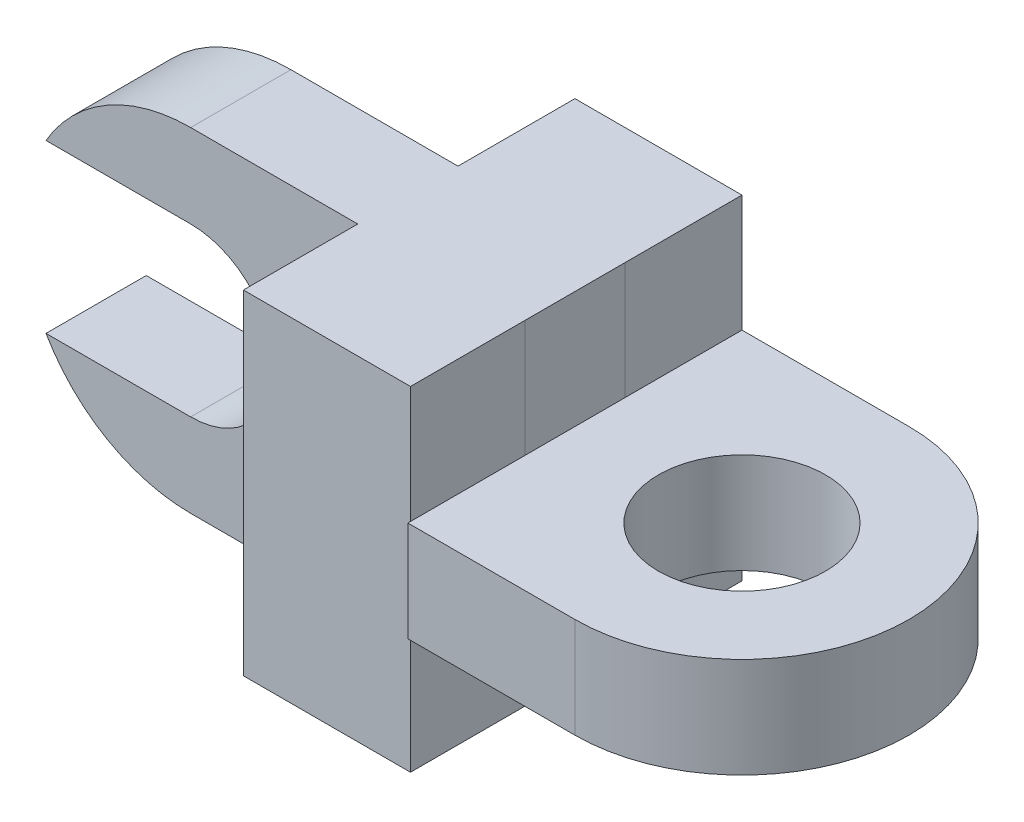
ISO-10303-21;
HEADER;
FILE_DESCRIPTION(('STEP AP214'),'2;1');
FILE_NAME('part.step','',(''),(''),'','','');
FILE_SCHEMA(('AUTOMOTIVE_DESIGN { 1 0 10303 214 1 1 1 1 }'));
ENDSEC;
DATA;
#1=APPLICATION_CONTEXT('core data for automotive mechanical design processes');
#2=APPLICATION_PROTOCOL_DEFINITION('international standard','automotive_design',2000,#1);
#3=PRODUCT_CONTEXT('',#1,'mechanical');
#4=PRODUCT('Part','Part','',(#3));
#5=PRODUCT_RELATED_PRODUCT_CATEGORY('part','',(#4));
#6=PRODUCT_DEFINITION_FORMATION('','',#4);
#7=PRODUCT_DEFINITION_CONTEXT('part definition',#1,'design');
#8=PRODUCT_DEFINITION('design','',#6,#7);
#9=PRODUCT_DEFINITION_SHAPE('','',#8);
#10=(LENGTH_UNIT() NAMED_UNIT(*) SI_UNIT(.MILLI.,.METRE.));
#11=(NAMED_UNIT(*) PLANE_ANGLE_UNIT() SI_UNIT($,.RADIAN.));
#12=(NAMED_UNIT(*) SI_UNIT($,.STERADIAN.) SOLID_ANGLE_UNIT());
#13=UNCERTAINTY_MEASURE_WITH_UNIT(LENGTH_MEASURE(1.E-05),#10,'distance_accuracy_value','');
#14=(GEOMETRIC_REPRESENTATION_CONTEXT(3) GLOBAL_UNCERTAINTY_ASSIGNED_CONTEXT((#13)) GLOBAL_UNIT_ASSIGNED_CONTEXT((#10,
#11,#12)) REPRESENTATION_CONTEXT('',''));
#15=CARTESIAN_POINT('',(0.,0.,0.));
#16=DIRECTION('',(0.,0.,1.));
#17=DIRECTION('',(1.,0.,0.));
#18=AXIS2_PLACEMENT_3D('',#15,#16,#17);
#19=CARTESIAN_POINT('',(-100.,0.,-30.));
#20=DIRECTION('',(0.,0.,1.));
#21=DIRECTION('',(1.,0.,0.));
#22=AXIS2_PLACEMENT_3D('',#19,#20,#21);
#23=PLANE('',#22);
#24=DIRECTION('',(1.,0.,0.));
#25=VECTOR('',#24,1.);
#26=CARTESIAN_POINT('',(-100.,-50.,-30.));
#27=LINE('',#26,#25);
#28=CARTESIAN_POINT('',(-0.00127018922199684,-50.,-30.));
#29=VERTEX_POINT('',#28);
#30=CARTESIAN_POINT('',(0.,-50.,-30.));
#31=VERTEX_POINT('',#30);
#32=EDGE_CURVE('E373',#29,#31,#27,.T.);
#33=ORIENTED_EDGE('',*,*,#32,.F.);
#34=DIRECTION('',(0.,1.,0.));
#35=VECTOR('',#34,1.);
#36=CARTESIAN_POINT('',(-0.00127018922199684,0.,-30.));
#37=LINE('',#36,#35);
#38=CARTESIAN_POINT('',(-0.00127018922199684,-15.,-30.));
#39=VERTEX_POINT('',#38);
#40=EDGE_CURVE('E216',#29,#39,#37,.T.);
#41=ORIENTED_EDGE('',*,*,#40,.T.);
#42=DIRECTION('',(-1.,0.,0.));
#43=VECTOR('',#42,1.);
#44=CARTESIAN_POINT('',(-100.,-15.,-30.));
#45=LINE('',#44,#43);
#46=CARTESIAN_POINT('',(0.,-15.,-30.));
#47=VERTEX_POINT('',#46);
#48=EDGE_CURVE('E348',#47,#39,#45,.T.);
#49=ORIENTED_EDGE('',*,*,#48,.F.);
#50=DIRECTION('',(0.,1.,0.));
#51=VECTOR('',#50,1.);
#52=CARTESIAN_POINT('',(0.,-15.,-30.));
#53=LINE('',#52,#51);
#54=EDGE_CURVE('E377',#31,#47,#53,.T.);
#55=ORIENTED_EDGE('',*,*,#54,.F.);
#56=EDGE_LOOP('',(#33,#41,#49,#55));
#57=FACE_BOUND('',#56,.T.);
#58=ADVANCED_FACE('F42',(#57),#23,.F.);
#59=DIRECTION('',(-1.,0.,0.));
#60=VECTOR('',#59,1.);
#61=CARTESIAN_POINT('',(-100.,15.,-30.));
#62=LINE('',#61,#60);
#63=CARTESIAN_POINT('',(0.,15.,-30.));
#64=VERTEX_POINT('',#63);
#65=CARTESIAN_POINT('',(-0.00127018922199684,15.,-30.));
#66=VERTEX_POINT('',#65);
#67=EDGE_CURVE('E337',#64,#66,#62,.T.);
#68=ORIENTED_EDGE('',*,*,#67,.T.);
#69=CARTESIAN_POINT('',(-0.00127018922199684,50.,-30.));
#70=VERTEX_POINT('',#69);
#71=EDGE_CURVE('E288',#66,#70,#37,.T.);
#72=ORIENTED_EDGE('',*,*,#71,.T.);
#73=DIRECTION('',(-1.,0.,0.));
#74=VECTOR('',#73,1.);
#75=CARTESIAN_POINT('',(-100.,50.,-30.));
#76=LINE('',#75,#74);
#77=CARTESIAN_POINT('',(0.,50.,-30.));
#78=VERTEX_POINT('',#77);
#79=EDGE_CURVE('E386',#78,#70,#76,.T.);
#80=ORIENTED_EDGE('',*,*,#79,.F.);
#81=DIRECTION('',(0.,1.,0.));
#82=VECTOR('',#81,1.);
#83=CARTESIAN_POINT('',(0.,50.,-30.));
#84=LINE('',#83,#82);
#85=EDGE_CURVE('E381',#64,#78,#84,.T.);
#86=ORIENTED_EDGE('',*,*,#85,.F.);
#87=EDGE_LOOP('',(#68,#72,#80,#86));
#88=FACE_BOUND('',#87,.T.);
#89=ADVANCED_FACE('F547',(#88),#23,.F.);
#90=CARTESIAN_POINT('',(-100.,0.,0.));
#91=DIRECTION('',(0.,0.,1.));
#92=DIRECTION('',(1.,0.,0.));
#93=AXIS2_PLACEMENT_3D('',#90,#91,#92);
#94=PLANE('',#93);
#95=DIRECTION('',(0.,1.,0.));
#96=VECTOR('',#95,1.);
#97=CARTESIAN_POINT('',(-0.00127018922199684,0.,0.));
#98=LINE('',#97,#96);
#99=CARTESIAN_POINT('',(-0.0012701892220246,-50.,0.));
#100=VERTEX_POINT('',#99);
#101=CARTESIAN_POINT('',(-0.00127018922199684,-15.,0.));
#102=VERTEX_POINT('',#101);
#103=EDGE_CURVE('E284',#100,#102,#98,.T.);
#104=ORIENTED_EDGE('',*,*,#103,.F.);
#105=DIRECTION('',(1.,0.,0.));
#106=VECTOR('',#105,1.);
#107=CARTESIAN_POINT('',(-100.,-50.,0.));
#108=LINE('',#107,#106);
#109=CARTESIAN_POINT('',(0.,-50.,0.));
#110=VERTEX_POINT('',#109);
#111=EDGE_CURVE('E410',#100,#110,#108,.T.);
#112=ORIENTED_EDGE('',*,*,#111,.T.);
#113=DIRECTION('',(0.,1.,0.));
#114=VECTOR('',#113,1.);
#115=CARTESIAN_POINT('',(0.,-15.,0.));
#116=LINE('',#115,#114);
#117=CARTESIAN_POINT('',(0.,-15.,0.));
#118=VERTEX_POINT('',#117);
#119=EDGE_CURVE('E414',#110,#118,#116,.T.);
#120=ORIENTED_EDGE('',*,*,#119,.T.);
#121=DIRECTION('',(-1.,0.,0.));
#122=VECTOR('',#121,1.);
#123=CARTESIAN_POINT('',(-100.,-15.,0.));
#124=LINE('',#123,#122);
#125=EDGE_CURVE('E11',#118,#102,#124,.T.);
#126=ORIENTED_EDGE('',*,*,#125,.T.);
#127=EDGE_LOOP('',(#104,#112,#120,#126));
#128=FACE_BOUND('',#127,.T.);
#129=ADVANCED_FACE('F540',(#128),#94,.T.);
#130=CARTESIAN_POINT('',(-0.00127018922199684,15.,0.));
#131=VERTEX_POINT('',#130);
#132=CARTESIAN_POINT('',(-0.00127018922199684,50.,0.));
#133=VERTEX_POINT('',#132);
#134=EDGE_CURVE('E275',#131,#133,#98,.T.);
#135=ORIENTED_EDGE('',*,*,#134,.F.);
#136=DIRECTION('',(-1.,0.,0.));
#137=VECTOR('',#136,1.);
#138=CARTESIAN_POINT('',(-100.,15.,0.));
#139=LINE('',#138,#137);
#140=CARTESIAN_POINT('',(0.,15.,0.));
#141=VERTEX_POINT('',#140);
#142=EDGE_CURVE('E52',#141,#131,#139,.T.);
#143=ORIENTED_EDGE('',*,*,#142,.F.);
#144=DIRECTION('',(0.,1.,0.));
#145=VECTOR('',#144,1.);
#146=CARTESIAN_POINT('',(0.,50.,0.));
#147=LINE('',#146,#145);
#148=CARTESIAN_POINT('',(0.,50.,0.));
#149=VERTEX_POINT('',#148);
#150=EDGE_CURVE('E418',#141,#149,#147,.T.);
#151=ORIENTED_EDGE('',*,*,#150,.T.);
#152=DIRECTION('',(-1.,0.,0.));
#153=VECTOR('',#152,1.);
#154=CARTESIAN_POINT('',(-100.,50.,0.));
#155=LINE('',#154,#153);
#156=EDGE_CURVE('E67',#149,#133,#155,.T.);
#157=ORIENTED_EDGE('',*,*,#156,.T.);
#158=EDGE_LOOP('',(#135,#143,#151,#157));
#159=FACE_BOUND('',#158,.T.);
#160=ADVANCED_FACE('F541',(#159),#94,.T.);
#161=CARTESIAN_POINT('',(-50.001270189222,50.,-30.));
#162=VERTEX_POINT('',#161);
#163=CARTESIAN_POINT('',(-100.,50.,-30.));
#164=VERTEX_POINT('',#163);
#165=EDGE_CURVE('E385',#162,#164,#76,.T.);
#166=ORIENTED_EDGE('',*,*,#165,.F.);
#167=DIRECTION('',(0.,-1.,0.));
#168=VECTOR('',#167,1.);
#169=CARTESIAN_POINT('',(-50.001270189222,0.,-30.));
#170=LINE('',#169,#168);
#171=CARTESIAN_POINT('',(-50.001270189222,-50.,-30.));
#172=VERTEX_POINT('',#171);
#173=EDGE_CURVE('E293',#162,#172,#170,.T.);
#174=ORIENTED_EDGE('',*,*,#173,.T.);
#175=CARTESIAN_POINT('',(-100.,-50.,-30.));
#176=VERTEX_POINT('',#175);
#177=EDGE_CURVE('E374',#176,#172,#27,.T.);
#178=ORIENTED_EDGE('',*,*,#177,.F.);
#179=CARTESIAN_POINT('',(-100.,0.,-30.));
#180=DIRECTION('',(0.,0.,1.));
#181=DIRECTION('',(1.,0.,0.));
#182=AXIS2_PLACEMENT_3D('',#179,#180,#181);
#183=CIRCLE('',#182,50.);
#184=CARTESIAN_POINT('',(-143.301270189222,-25.,-30.));
#185=VERTEX_POINT('',#184);
#186=EDGE_CURVE('E369',#185,#176,#183,.T.);
#187=ORIENTED_EDGE('',*,*,#186,.F.);
#188=DIRECTION('',(-1.,0.,0.));
#189=VECTOR('',#188,1.);
#190=CARTESIAN_POINT('',(-100.,-25.,-30.));
#191=LINE('',#190,#189);
#192=CARTESIAN_POINT('',(-100.,-25.,-30.));
#193=VERTEX_POINT('',#192);
#194=EDGE_CURVE('E365',#193,#185,#191,.T.);
#195=ORIENTED_EDGE('',*,*,#194,.F.);
#196=CARTESIAN_POINT('',(-100.,0.,-30.));
#197=DIRECTION('',(0.,0.,-1.));
#198=DIRECTION('',(1.,0.,0.));
#199=AXIS2_PLACEMENT_3D('',#196,#197,#198);
#200=CIRCLE('',#199,25.);
#201=CARTESIAN_POINT('',(-100.,25.,-30.));
#202=VERTEX_POINT('',#201);
#203=EDGE_CURVE('E361',#202,#193,#200,.T.);
#204=ORIENTED_EDGE('',*,*,#203,.F.);
#205=DIRECTION('',(1.,0.,0.));
#206=VECTOR('',#205,1.);
#207=CARTESIAN_POINT('',(-100.,25.,-30.));
#208=LINE('',#207,#206);
#209=CARTESIAN_POINT('',(-143.301270189222,25.,-30.));
#210=VERTEX_POINT('',#209);
#211=EDGE_CURVE('E357',#210,#202,#208,.T.);
#212=ORIENTED_EDGE('',*,*,#211,.F.);
#213=CARTESIAN_POINT('',(-100.,0.,-30.));
#214=DIRECTION('',(0.,0.,1.));
#215=DIRECTION('',(1.,0.,0.));
#216=AXIS2_PLACEMENT_3D('',#213,#214,#215);
#217=CIRCLE('',#216,50.);
#218=EDGE_CURVE('E353',#164,#210,#217,.T.);
#219=ORIENTED_EDGE('',*,*,#218,.F.);
#220=EDGE_LOOP('',(#166,#174,#178,#187,#195,#204,#212,#219));
#221=FACE_BOUND('',#220,.T.);
#222=ADVANCED_FACE('F530',(#221),#23,.F.);
#223=DIRECTION('',(0.,-1.,0.));
#224=VECTOR('',#223,1.);
#225=CARTESIAN_POINT('',(-50.001270189222,0.,0.));
#226=LINE('',#225,#224);
#227=CARTESIAN_POINT('',(-50.001270189222,50.,0.));
#228=VERTEX_POINT('',#227);
#229=CARTESIAN_POINT('',(-50.001270189222,-50.,0.));
#230=VERTEX_POINT('',#229);
#231=EDGE_CURVE('E59',#228,#230,#226,.T.);
#232=ORIENTED_EDGE('',*,*,#231,.F.);
#233=CARTESIAN_POINT('',(-100.,50.,0.));
#234=VERTEX_POINT('',#233);
#235=EDGE_CURVE('E421',#228,#234,#155,.T.);
#236=ORIENTED_EDGE('',*,*,#235,.T.);
#237=CARTESIAN_POINT('',(-100.,0.,0.));
#238=DIRECTION('',(0.,0.,1.));
#239=DIRECTION('',(1.,0.,0.));
#240=AXIS2_PLACEMENT_3D('',#237,#238,#239);
#241=CIRCLE('',#240,50.);
#242=CARTESIAN_POINT('',(-143.301270189222,25.,0.));
#243=VERTEX_POINT('',#242);
#244=EDGE_CURVE('E352',#234,#243,#241,.T.);
#245=ORIENTED_EDGE('',*,*,#244,.T.);
#246=DIRECTION('',(1.,0.,0.));
#247=VECTOR('',#246,1.);
#248=CARTESIAN_POINT('',(-100.,25.,0.));
#249=LINE('',#248,#247);
#250=CARTESIAN_POINT('',(-100.,25.,0.));
#251=VERTEX_POINT('',#250);
#252=EDGE_CURVE('E394',#243,#251,#249,.T.);
#253=ORIENTED_EDGE('',*,*,#252,.T.);
#254=CARTESIAN_POINT('',(-100.,0.,0.));
#255=DIRECTION('',(0.,0.,-1.));
#256=DIRECTION('',(1.,0.,0.));
#257=AXIS2_PLACEMENT_3D('',#254,#255,#256);
#258=CIRCLE('',#257,25.);
#259=CARTESIAN_POINT('',(-100.,-25.,0.));
#260=VERTEX_POINT('',#259);
#261=EDGE_CURVE('E398',#251,#260,#258,.T.);
#262=ORIENTED_EDGE('',*,*,#261,.T.);
#263=DIRECTION('',(-1.,0.,0.));
#264=VECTOR('',#263,1.);
#265=CARTESIAN_POINT('',(-100.,-25.,0.));
#266=LINE('',#265,#264);
#267=CARTESIAN_POINT('',(-143.301270189222,-25.,0.));
#268=VERTEX_POINT('',#267);
#269=EDGE_CURVE('E402',#260,#268,#266,.T.);
#270=ORIENTED_EDGE('',*,*,#269,.T.);
#271=CARTESIAN_POINT('',(-100.,0.,0.));
#272=DIRECTION('',(0.,0.,1.));
#273=DIRECTION('',(1.,0.,0.));
#274=AXIS2_PLACEMENT_3D('',#271,#272,#273);
#275=CIRCLE('',#274,50.);
#276=CARTESIAN_POINT('',(-100.,-50.,0.));
#277=VERTEX_POINT('',#276);
#278=EDGE_CURVE('E406',#268,#277,#275,.T.);
#279=ORIENTED_EDGE('',*,*,#278,.T.);
#280=EDGE_CURVE('E411',#277,#230,#108,.T.);
#281=ORIENTED_EDGE('',*,*,#280,.T.);
#282=EDGE_LOOP('',(#232,#236,#245,#253,#262,#270,#279,#281));
#283=FACE_BOUND('',#282,.T.);
#284=ADVANCED_FACE('F537',(#283),#94,.T.);
#285=CARTESIAN_POINT('',(-100.,0.,-30.));
#286=DIRECTION('',(0.,0.,1.));
#287=DIRECTION('',(1.,0.,0.));
#288=AXIS2_PLACEMENT_3D('',#285,#286,#287);
#289=CYLINDRICAL_SURFACE('',#288,50.);
#290=ORIENTED_EDGE('',*,*,#244,.F.);
#291=DIRECTION('',(0.,0.,1.));
#292=VECTOR('',#291,1.);
#293=CARTESIAN_POINT('',(-100.,50.,-30.));
#294=LINE('',#293,#292);
#295=EDGE_CURVE('E424',#164,#234,#294,.T.);
#296=ORIENTED_EDGE('',*,*,#295,.F.);
#297=ORIENTED_EDGE('',*,*,#218,.T.);
#298=DIRECTION('',(0.,0.,1.));
#299=VECTOR('',#298,1.);
#300=CARTESIAN_POINT('',(-143.301270189222,25.,-30.));
#301=LINE('',#300,#299);
#302=EDGE_CURVE('E390',#210,#243,#301,.T.);
#303=ORIENTED_EDGE('',*,*,#302,.T.);
#304=EDGE_LOOP('',(#290,#296,#297,#303));
#305=FACE_BOUND('',#304,.T.);
#306=ADVANCED_FACE('F44',(#305),#289,.T.);
#307=CARTESIAN_POINT('',(-100.,50.,-30.));
#308=DIRECTION('',(0.,1.,0.));
#309=DIRECTION('',(0.,0.,1.));
#310=AXIS2_PLACEMENT_3D('',#307,#308,#309);
#311=PLANE('',#310);
#312=ORIENTED_EDGE('',*,*,#235,.F.);
#313=DIRECTION('',(0.,0.,1.));
#314=VECTOR('',#313,1.);
#315=CARTESIAN_POINT('',(-50.001270189222,50.,34.2134446650193));
#316=LINE('',#315,#314);
#317=CARTESIAN_POINT('',(-50.001270189222,50.,34.2134446650193));
#318=VERTEX_POINT('',#317);
#319=EDGE_CURVE('E263',#228,#318,#316,.T.);
#320=ORIENTED_EDGE('',*,*,#319,.T.);
#321=DIRECTION('',(1.,0.,0.));
#322=VECTOR('',#321,1.);
#323=CARTESIAN_POINT('',(-50.001270189222,50.,34.2134446650193));
#324=LINE('',#323,#322);
#325=CARTESIAN_POINT('',(-0.00127018922199684,50.,34.2134446650193));
#326=VERTEX_POINT('',#325);
#327=EDGE_CURVE('E222',#318,#326,#324,.T.);
#328=ORIENTED_EDGE('',*,*,#327,.T.);
#329=DIRECTION('',(0.,0.,-1.));
#330=VECTOR('',#329,1.);
#331=CARTESIAN_POINT('',(-0.00127018922199684,50.,34.2134446650193));
#332=LINE('',#331,#330);
#333=EDGE_CURVE('E254',#326,#133,#332,.T.);
#334=ORIENTED_EDGE('',*,*,#333,.T.);
#335=ORIENTED_EDGE('',*,*,#156,.F.);
#336=DIRECTION('',(0.,0.,1.));
#337=VECTOR('',#336,1.);
#338=CARTESIAN_POINT('',(0.,50.,-30.));
#339=LINE('',#338,#337);
#340=EDGE_CURVE('E428',#78,#149,#339,.T.);
#341=ORIENTED_EDGE('',*,*,#340,.F.);
#342=ORIENTED_EDGE('',*,*,#79,.T.);
#343=CARTESIAN_POINT('',(-0.00127018922199684,50.,-65.));
#344=VERTEX_POINT('',#343);
#345=EDGE_CURVE('E259',#70,#344,#332,.T.);
#346=ORIENTED_EDGE('',*,*,#345,.T.);
#347=DIRECTION('',(-1.,0.,0.));
#348=VECTOR('',#347,1.);
#349=CARTESIAN_POINT('',(-50.001270189222,50.,-65.));
#350=LINE('',#349,#348);
#351=CARTESIAN_POINT('',(-50.001270189222,50.,-65.));
#352=VERTEX_POINT('',#351);
#353=EDGE_CURVE('E258',#344,#352,#350,.T.);
#354=ORIENTED_EDGE('',*,*,#353,.T.);
#355=EDGE_CURVE('E264',#352,#162,#316,.T.);
#356=ORIENTED_EDGE('',*,*,#355,.T.);
#357=ORIENTED_EDGE('',*,*,#165,.T.);
#358=ORIENTED_EDGE('',*,*,#295,.T.);
#359=EDGE_LOOP('',(#312,#320,#328,#334,#335,#341,#342,#346,#354,#356,#357,#358));
#360=FACE_BOUND('',#359,.T.);
#361=ADVANCED_FACE('F500',(#360),#311,.T.);
#362=CARTESIAN_POINT('',(0.,50.,-30.));
#363=DIRECTION('',(1.,0.,0.));
#364=DIRECTION('',(0.,1.,0.));
#365=AXIS2_PLACEMENT_3D('',#362,#363,#364);
#366=PLANE('',#365);
#367=ORIENTED_EDGE('',*,*,#150,.F.);
#368=DIRECTION('',(0.,0.,1.));
#369=VECTOR('',#368,1.);
#370=CARTESIAN_POINT('',(0.,15.,-30.));
#371=LINE('',#370,#369);
#372=EDGE_CURVE('E431',#64,#141,#371,.T.);
#373=ORIENTED_EDGE('',*,*,#372,.F.);
#374=ORIENTED_EDGE('',*,*,#85,.T.);
#375=ORIENTED_EDGE('',*,*,#340,.T.);
#376=EDGE_LOOP('',(#367,#373,#374,#375));
#377=FACE_BOUND('',#376,.T.);
#378=ADVANCED_FACE('F669',(#377),#366,.T.);
#379=CARTESIAN_POINT('',(0.,15.,-30.));
#380=DIRECTION('',(0.,1.,0.));
#381=DIRECTION('',(0.,0.,1.));
#382=AXIS2_PLACEMENT_3D('',#379,#380,#381);
#383=PLANE('',#382);
#384=CARTESIAN_POINT('',(49.998729810778,15.,-15.));
#385=DIRECTION('',(0.,1.,0.));
#386=DIRECTION('',(0.,0.,1.));
#387=AXIS2_PLACEMENT_3D('',#384,#385,#386);
#388=CIRCLE('',#387,25.);
#389=CARTESIAN_POINT('',(49.998729810778,15.,9.99999999999999));
#390=VERTEX_POINT('',#389);
#391=EDGE_CURVE('E297',#390,#390,#388,.T.);
#392=ORIENTED_EDGE('',*,*,#391,.F.);
#393=EDGE_LOOP('',(#392));
#394=FACE_BOUND('',#393,.T.);
#395=DIRECTION('',(1.,0.,0.));
#396=VECTOR('',#395,1.);
#397=CARTESIAN_POINT('',(-0.00127018922199684,15.,35.));
#398=LINE('',#397,#396);
#399=CARTESIAN_POINT('',(-0.00127018922199684,15.,35.));
#400=VERTEX_POINT('',#399);
#401=CARTESIAN_POINT('',(49.998729810778,15.,35.));
#402=VERTEX_POINT('',#401);
#403=EDGE_CURVE('E317',#400,#402,#398,.T.);
#404=ORIENTED_EDGE('',*,*,#403,.T.);
#405=CARTESIAN_POINT('',(49.998729810778,15.,-15.));
#406=DIRECTION('',(0.,1.,0.));
#407=DIRECTION('',(0.,0.,1.));
#408=AXIS2_PLACEMENT_3D('',#405,#406,#407);
#409=CIRCLE('',#408,50.);
#410=CARTESIAN_POINT('',(49.998729810778,15.,-65.));
#411=VERTEX_POINT('',#410);
#412=EDGE_CURVE('E321',#402,#411,#409,.T.);
#413=ORIENTED_EDGE('',*,*,#412,.T.);
#414=DIRECTION('',(-1.,0.,0.));
#415=VECTOR('',#414,1.);
#416=CARTESIAN_POINT('',(49.998729810778,15.,-65.));
#417=LINE('',#416,#415);
#418=CARTESIAN_POINT('',(-0.00127018922199684,15.,-65.));
#419=VERTEX_POINT('',#418);
#420=EDGE_CURVE('E324',#411,#419,#417,.T.);
#421=ORIENTED_EDGE('',*,*,#420,.T.);
#422=DIRECTION('',(0.,0.,1.));
#423=VECTOR('',#422,1.);
#424=CARTESIAN_POINT('',(-0.00127018922199684,15.,-65.));
#425=LINE('',#424,#423);
#426=EDGE_CURVE('E306',#419,#66,#425,.T.);
#427=ORIENTED_EDGE('',*,*,#426,.T.);
#428=ORIENTED_EDGE('',*,*,#67,.F.);
#429=ORIENTED_EDGE('',*,*,#372,.T.);
#430=ORIENTED_EDGE('',*,*,#142,.T.);
#431=CARTESIAN_POINT('',(-0.00127018922199684,15.,34.2134446650193));
#432=VERTEX_POINT('',#431);
#433=EDGE_CURVE('E332',#131,#432,#425,.T.);
#434=ORIENTED_EDGE('',*,*,#433,.T.);
#435=EDGE_CURVE('E328',#432,#400,#425,.T.);
#436=ORIENTED_EDGE('',*,*,#435,.T.);
#437=EDGE_LOOP('',(#404,#413,#421,#427,#428,#429,#430,#434,#436));
#438=FACE_BOUND('',#437,.T.);
#439=ADVANCED_FACE('F460',(#394,#438),#383,.T.);
#440=CARTESIAN_POINT('',(0.,-15.,-30.));
#441=DIRECTION('',(0.,-1.,0.));
#442=DIRECTION('',(0.,0.,-1.));
#443=AXIS2_PLACEMENT_3D('',#440,#441,#442);
#444=PLANE('',#443);
#445=CARTESIAN_POINT('',(49.998729810778,-15.,-15.));
#446=DIRECTION('',(0.,-1.,0.));
#447=DIRECTION('',(0.,0.,-1.));
#448=AXIS2_PLACEMENT_3D('',#445,#446,#447);
#449=CIRCLE('',#448,25.);
#450=CARTESIAN_POINT('',(49.998729810778,-15.,9.99999999999999));
#451=VERTEX_POINT('',#450);
#452=EDGE_CURVE('E46',#451,#451,#449,.T.);
#453=ORIENTED_EDGE('',*,*,#452,.F.);
#454=EDGE_LOOP('',(#453));
#455=FACE_BOUND('',#454,.T.);
#456=CARTESIAN_POINT('',(49.998729810778,-15.,-15.));
#457=DIRECTION('',(0.,1.,0.));
#458=DIRECTION('',(0.,0.,1.));
#459=AXIS2_PLACEMENT_3D('',#456,#457,#458);
#460=CIRCLE('',#459,50.);
#461=CARTESIAN_POINT('',(49.998729810778,-15.,35.));
#462=VERTEX_POINT('',#461);
#463=CARTESIAN_POINT('',(49.998729810778,-15.,-65.));
#464=VERTEX_POINT('',#463);
#465=EDGE_CURVE('E305',#462,#464,#460,.T.);
#466=ORIENTED_EDGE('',*,*,#465,.F.);
#467=DIRECTION('',(1.,0.,0.));
#468=VECTOR('',#467,1.);
#469=CARTESIAN_POINT('',(-0.00127018922199684,-15.,35.));
#470=LINE('',#469,#468);
#471=CARTESIAN_POINT('',(-0.00127018922199684,-15.,35.));
#472=VERTEX_POINT('',#471);
#473=EDGE_CURVE('E301',#472,#462,#470,.T.);
#474=ORIENTED_EDGE('',*,*,#473,.F.);
#475=DIRECTION('',(0.,0.,1.));
#476=VECTOR('',#475,1.);
#477=CARTESIAN_POINT('',(-0.00127018922199684,-15.,-65.));
#478=LINE('',#477,#476);
#479=CARTESIAN_POINT('',(-0.00127018922199684,-15.,34.2134446650193));
#480=VERTEX_POINT('',#479);
#481=EDGE_CURVE('E311',#480,#472,#478,.T.);
#482=ORIENTED_EDGE('',*,*,#481,.F.);
#483=EDGE_CURVE('E316',#102,#480,#478,.T.);
#484=ORIENTED_EDGE('',*,*,#483,.F.);
#485=ORIENTED_EDGE('',*,*,#125,.F.);
#486=DIRECTION('',(0.,0.,1.));
#487=VECTOR('',#486,1.);
#488=CARTESIAN_POINT('',(0.,-15.,-30.));
#489=LINE('',#488,#487);
#490=EDGE_CURVE('E435',#47,#118,#489,.T.);
#491=ORIENTED_EDGE('',*,*,#490,.F.);
#492=ORIENTED_EDGE('',*,*,#48,.T.);
#493=CARTESIAN_POINT('',(-0.00127018922199684,-15.,-65.));
#494=VERTEX_POINT('',#493);
#495=EDGE_CURVE('E312',#494,#39,#478,.T.);
#496=ORIENTED_EDGE('',*,*,#495,.F.);
#497=DIRECTION('',(-1.,0.,0.));
#498=VECTOR('',#497,1.);
#499=CARTESIAN_POINT('',(49.998729810778,-15.,-65.));
#500=LINE('',#499,#498);
#501=EDGE_CURVE('E231',#464,#494,#500,.T.);
#502=ORIENTED_EDGE('',*,*,#501,.F.);
#503=EDGE_LOOP('',(#466,#474,#482,#484,#485,#491,#492,#496,#502));
#504=FACE_BOUND('',#503,.T.);
#505=ADVANCED_FACE('F730',(#455,#504),#444,.T.);
#506=CARTESIAN_POINT('',(0.,-15.,-30.));
#507=DIRECTION('',(1.,0.,0.));
#508=DIRECTION('',(0.,1.,0.));
#509=AXIS2_PLACEMENT_3D('',#506,#507,#508);
#510=PLANE('',#509);
#511=ORIENTED_EDGE('',*,*,#119,.F.);
#512=DIRECTION('',(0.,0.,1.));
#513=VECTOR('',#512,1.);
#514=CARTESIAN_POINT('',(0.,-50.,-30.));
#515=LINE('',#514,#513);
#516=EDGE_CURVE('E438',#31,#110,#515,.T.);
#517=ORIENTED_EDGE('',*,*,#516,.F.);
#518=ORIENTED_EDGE('',*,*,#54,.T.);
#519=ORIENTED_EDGE('',*,*,#490,.T.);
#520=EDGE_LOOP('',(#511,#517,#518,#519));
#521=FACE_BOUND('',#520,.T.);
#522=ADVANCED_FACE('F654',(#521),#510,.T.);
#523=CARTESIAN_POINT('',(-100.,-50.,-30.));
#524=DIRECTION('',(0.,-1.,0.));
#525=DIRECTION('',(0.,0.,-1.));
#526=AXIS2_PLACEMENT_3D('',#523,#524,#525);
#527=PLANE('',#526);
#528=ORIENTED_EDGE('',*,*,#177,.T.);
#529=DIRECTION('',(0.,0.,1.));
#530=VECTOR('',#529,1.);
#531=CARTESIAN_POINT('',(-50.001270189222,-50.,34.2134446650193));
#532=LINE('',#531,#530);
#533=CARTESIAN_POINT('',(-50.001270189222,-50.,-65.));
#534=VERTEX_POINT('',#533);
#535=EDGE_CURVE('E240',#534,#172,#532,.T.);
#536=ORIENTED_EDGE('',*,*,#535,.F.);
#537=DIRECTION('',(-1.,0.,0.));
#538=VECTOR('',#537,1.);
#539=CARTESIAN_POINT('',(-50.001270189222,-50.,-65.));
#540=LINE('',#539,#538);
#541=CARTESIAN_POINT('',(-0.00127018922199684,-50.,-65.));
#542=VERTEX_POINT('',#541);
#543=EDGE_CURVE('E228',#542,#534,#540,.T.);
#544=ORIENTED_EDGE('',*,*,#543,.F.);
#545=DIRECTION('',(0.,0.,-1.));
#546=VECTOR('',#545,1.);
#547=CARTESIAN_POINT('',(-0.00127018922199684,-50.,34.2134446650193));
#548=LINE('',#547,#546);
#549=EDGE_CURVE('E210',#29,#542,#548,.T.);
#550=ORIENTED_EDGE('',*,*,#549,.F.);
#551=ORIENTED_EDGE('',*,*,#32,.T.);
#552=ORIENTED_EDGE('',*,*,#516,.T.);
#553=ORIENTED_EDGE('',*,*,#111,.F.);
#554=CARTESIAN_POINT('',(-0.00127018922199684,-50.,34.2134446650193));
#555=VERTEX_POINT('',#554);
#556=EDGE_CURVE('E221',#555,#100,#548,.T.);
#557=ORIENTED_EDGE('',*,*,#556,.F.);
#558=DIRECTION('',(1.,0.,0.));
#559=VECTOR('',#558,1.);
#560=CARTESIAN_POINT('',(-50.001270189222,-50.,34.2134446650193));
#561=LINE('',#560,#559);
#562=CARTESIAN_POINT('',(-50.001270189222,-50.,34.2134446650193));
#563=VERTEX_POINT('',#562);
#564=EDGE_CURVE('E250',#563,#555,#561,.T.);
#565=ORIENTED_EDGE('',*,*,#564,.F.);
#566=EDGE_CURVE('E242',#230,#563,#532,.T.);
#567=ORIENTED_EDGE('',*,*,#566,.F.);
#568=ORIENTED_EDGE('',*,*,#280,.F.);
#569=DIRECTION('',(0.,0.,1.));
#570=VECTOR('',#569,1.);
#571=CARTESIAN_POINT('',(-100.,-50.,-30.));
#572=LINE('',#571,#570);
#573=EDGE_CURVE('E442',#176,#277,#572,.T.);
#574=ORIENTED_EDGE('',*,*,#573,.F.);
#575=EDGE_LOOP('',(#528,#536,#544,#550,#551,#552,#553,#557,#565,#567,#568,#574));
#576=FACE_BOUND('',#575,.T.);
#577=ADVANCED_FACE('F239',(#576),#527,.T.);
#578=CARTESIAN_POINT('',(-100.,0.,-30.));
#579=DIRECTION('',(0.,0.,1.));
#580=DIRECTION('',(1.,0.,0.));
#581=AXIS2_PLACEMENT_3D('',#578,#579,#580);
#582=CYLINDRICAL_SURFACE('',#581,50.);
#583=ORIENTED_EDGE('',*,*,#278,.F.);
#584=DIRECTION('',(0.,0.,1.));
#585=VECTOR('',#584,1.);
#586=CARTESIAN_POINT('',(-143.301270189222,-25.,-30.));
#587=LINE('',#586,#585);
#588=EDGE_CURVE('E445',#185,#268,#587,.T.);
#589=ORIENTED_EDGE('',*,*,#588,.F.);
#590=ORIENTED_EDGE('',*,*,#186,.T.);
#591=ORIENTED_EDGE('',*,*,#573,.T.);
#592=EDGE_LOOP('',(#583,#589,#590,#591));
#593=FACE_BOUND('',#592,.T.);
#594=ADVANCED_FACE('F653',(#593),#582,.T.);
#595=CARTESIAN_POINT('',(-100.,-25.,-30.));
#596=DIRECTION('',(0.,1.,0.));
#597=DIRECTION('',(0.,0.,1.));
#598=AXIS2_PLACEMENT_3D('',#595,#596,#597);
#599=PLANE('',#598);
#600=ORIENTED_EDGE('',*,*,#269,.F.);
#601=DIRECTION('',(0.,0.,1.));
#602=VECTOR('',#601,1.);
#603=CARTESIAN_POINT('',(-100.,-25.,-30.));
#604=LINE('',#603,#602);
#605=EDGE_CURVE('E448',#193,#260,#604,.T.);
#606=ORIENTED_EDGE('',*,*,#605,.F.);
#607=ORIENTED_EDGE('',*,*,#194,.T.);
#608=ORIENTED_EDGE('',*,*,#588,.T.);
#609=EDGE_LOOP('',(#600,#606,#607,#608));
#610=FACE_BOUND('',#609,.T.);
#611=ADVANCED_FACE('F763',(#610),#599,.T.);
#612=CARTESIAN_POINT('',(-100.,0.,-30.));
#613=DIRECTION('',(0.,0.,1.));
#614=DIRECTION('',(1.,0.,0.));
#615=AXIS2_PLACEMENT_3D('',#612,#613,#614);
#616=CYLINDRICAL_SURFACE('',#615,25.);
#617=ORIENTED_EDGE('',*,*,#261,.F.);
#618=DIRECTION('',(0.,0.,1.));
#619=VECTOR('',#618,1.);
#620=CARTESIAN_POINT('',(-100.,25.,-30.));
#621=LINE('',#620,#619);
#622=EDGE_CURVE('E451',#202,#251,#621,.T.);
#623=ORIENTED_EDGE('',*,*,#622,.F.);
#624=ORIENTED_EDGE('',*,*,#203,.T.);
#625=ORIENTED_EDGE('',*,*,#605,.T.);
#626=EDGE_LOOP('',(#617,#623,#624,#625));
#627=FACE_BOUND('',#626,.T.);
#628=ADVANCED_FACE('F753',(#627),#616,.F.);
#629=CARTESIAN_POINT('',(-100.,25.,-30.));
#630=DIRECTION('',(0.,-1.,0.));
#631=DIRECTION('',(0.,0.,-1.));
#632=AXIS2_PLACEMENT_3D('',#629,#630,#631);
#633=PLANE('',#632);
#634=ORIENTED_EDGE('',*,*,#252,.F.);
#635=ORIENTED_EDGE('',*,*,#302,.F.);
#636=ORIENTED_EDGE('',*,*,#211,.T.);
#637=ORIENTED_EDGE('',*,*,#622,.T.);
#638=EDGE_LOOP('',(#634,#635,#636,#637));
#639=FACE_BOUND('',#638,.T.);
#640=ADVANCED_FACE('F535',(#639),#633,.T.);
#641=CARTESIAN_POINT('',(-0.00127018922199684,-15.,35.));
#642=DIRECTION('',(0.,0.,1.));
#643=DIRECTION('',(1.,0.,0.));
#644=AXIS2_PLACEMENT_3D('',#641,#642,#643);
#645=PLANE('',#644);
#646=ORIENTED_EDGE('',*,*,#403,.F.);
#647=DIRECTION('',(0.,1.,0.));
#648=VECTOR('',#647,1.);
#649=CARTESIAN_POINT('',(-0.00127018922199684,-15.,35.));
#650=LINE('',#649,#648);
#651=EDGE_CURVE('E333',#472,#400,#650,.T.);
#652=ORIENTED_EDGE('',*,*,#651,.F.);
#653=ORIENTED_EDGE('',*,*,#473,.T.);
#654=DIRECTION('',(0.,1.,0.));
#655=VECTOR('',#654,1.);
#656=CARTESIAN_POINT('',(49.998729810778,-15.,35.));
#657=LINE('',#656,#655);
#658=EDGE_CURVE('E315',#462,#402,#657,.T.);
#659=ORIENTED_EDGE('',*,*,#658,.T.);
#660=EDGE_LOOP('',(#646,#652,#653,#659));
#661=FACE_BOUND('',#660,.T.);
#662=ADVANCED_FACE('F478',(#661),#645,.T.);
#663=CARTESIAN_POINT('',(-0.00127018922199684,-15.,-65.));
#664=DIRECTION('',(-1.,0.,0.));
#665=DIRECTION('',(0.,0.,1.));
#666=AXIS2_PLACEMENT_3D('',#663,#664,#665);
#667=PLANE('',#666);
#668=DIRECTION('',(0.,1.,0.));
#669=VECTOR('',#668,1.);
#670=CARTESIAN_POINT('',(-0.00127018922199684,-50.,34.2134446650193));
#671=LINE('',#670,#669);
#672=EDGE_CURVE('E276',#480,#432,#671,.T.);
#673=ORIENTED_EDGE('',*,*,#672,.F.);
#674=ORIENTED_EDGE('',*,*,#481,.T.);
#675=ORIENTED_EDGE('',*,*,#651,.T.);
#676=ORIENTED_EDGE('',*,*,#435,.F.);
#677=EDGE_LOOP('',(#673,#674,#675,#676));
#678=FACE_BOUND('',#677,.T.);
#679=ADVANCED_FACE('F474',(#678),#667,.T.);
#680=CARTESIAN_POINT('',(49.998729810778,-15.,-15.));
#681=DIRECTION('',(0.,1.,0.));
#682=DIRECTION('',(0.,0.,1.));
#683=AXIS2_PLACEMENT_3D('',#680,#681,#682);
#684=CYLINDRICAL_SURFACE('',#683,50.);
#685=ORIENTED_EDGE('',*,*,#412,.F.);
#686=ORIENTED_EDGE('',*,*,#658,.F.);
#687=ORIENTED_EDGE('',*,*,#465,.T.);
#688=DIRECTION('',(0.,1.,0.));
#689=VECTOR('',#688,1.);
#690=CARTESIAN_POINT('',(49.998729810778,-15.,-65.));
#691=LINE('',#690,#689);
#692=EDGE_CURVE('E338',#464,#411,#691,.T.);
#693=ORIENTED_EDGE('',*,*,#692,.T.);
#694=EDGE_LOOP('',(#685,#686,#687,#693));
#695=FACE_BOUND('',#694,.T.);
#696=ADVANCED_FACE('F481',(#695),#684,.T.);
#697=CARTESIAN_POINT('',(49.998729810778,-15.,-65.));
#698=DIRECTION('',(0.,0.,-1.));
#699=DIRECTION('',(-1.,0.,0.));
#700=AXIS2_PLACEMENT_3D('',#697,#698,#699);
#701=PLANE('',#700);
#702=ORIENTED_EDGE('',*,*,#420,.F.);
#703=ORIENTED_EDGE('',*,*,#692,.F.);
#704=ORIENTED_EDGE('',*,*,#501,.T.);
#705=DIRECTION('',(0.,1.,0.));
#706=VECTOR('',#705,1.);
#707=CARTESIAN_POINT('',(-0.00127018922199684,-50.,-65.));
#708=LINE('',#707,#706);
#709=EDGE_CURVE('E213',#542,#494,#708,.T.);
#710=ORIENTED_EDGE('',*,*,#709,.F.);
#711=ORIENTED_EDGE('',*,*,#543,.T.);
#712=DIRECTION('',(0.,1.,0.));
#713=VECTOR('',#712,1.);
#714=CARTESIAN_POINT('',(-50.001270189222,-50.,-65.));
#715=LINE('',#714,#713);
#716=EDGE_CURVE('E234',#534,#352,#715,.T.);
#717=ORIENTED_EDGE('',*,*,#716,.T.);
#718=ORIENTED_EDGE('',*,*,#353,.F.);
#719=EDGE_CURVE('E235',#419,#344,#708,.T.);
#720=ORIENTED_EDGE('',*,*,#719,.F.);
#721=EDGE_LOOP('',(#702,#703,#704,#710,#711,#717,#718,#720));
#722=FACE_BOUND('',#721,.T.);
#723=ADVANCED_FACE('F227',(#722),#701,.T.);
#724=CARTESIAN_POINT('',(49.998729810778,-78.,-15.));
#725=DIRECTION('',(0.,1.,0.));
#726=DIRECTION('',(0.,0.,1.));
#727=AXIS2_PLACEMENT_3D('',#724,#725,#726);
#728=CYLINDRICAL_SURFACE('',#727,25.);
#729=CARTESIAN_POINT('',(49.998729810778,-15.,9.99999999999999));
#730=CARTESIAN_POINT('',(49.998729810778,-14.6875,9.99999999999999));
#731=CARTESIAN_POINT('',(49.998729810778,-14.375,9.99999999999999));
#732=CARTESIAN_POINT('',(49.998729810778,-13.75,9.99999999999999));
#733=CARTESIAN_POINT('',(49.998729810778,-13.4375,9.99999999999999));
#734=CARTESIAN_POINT('',(49.998729810778,-12.8125,9.99999999999999));
#735=CARTESIAN_POINT('',(49.998729810778,-12.5,9.99999999999999));
#736=CARTESIAN_POINT('',(49.998729810778,-11.875,9.99999999999999));
#737=CARTESIAN_POINT('',(49.998729810778,-11.5625,9.99999999999999));
#738=CARTESIAN_POINT('',(49.998729810778,-10.9375,9.99999999999999));
#739=CARTESIAN_POINT('',(49.998729810778,-10.625,9.99999999999999));
#740=CARTESIAN_POINT('',(49.998729810778,-9.99999999999999,9.99999999999999));
#741=CARTESIAN_POINT('',(49.998729810778,-9.68749999999999,9.99999999999999));
#742=CARTESIAN_POINT('',(49.998729810778,-9.06249999999999,9.99999999999999));
#743=CARTESIAN_POINT('',(49.998729810778,-8.74999999999999,9.99999999999999));
#744=CARTESIAN_POINT('',(49.998729810778,-8.12499999999999,9.99999999999999));
#745=CARTESIAN_POINT('',(49.998729810778,-7.81249999999999,9.99999999999999));
#746=CARTESIAN_POINT('',(49.998729810778,-7.18749999999999,9.99999999999999));
#747=CARTESIAN_POINT('',(49.998729810778,-6.875,9.99999999999999));
#748=CARTESIAN_POINT('',(49.998729810778,-6.25,9.99999999999999));
#749=CARTESIAN_POINT('',(49.998729810778,-5.93749999999999,9.99999999999999));
#750=CARTESIAN_POINT('',(49.998729810778,-5.31249999999999,9.99999999999999));
#751=CARTESIAN_POINT('',(49.998729810778,-4.99999999999999,9.99999999999999));
#752=CARTESIAN_POINT('',(49.998729810778,-4.375,9.99999999999999));
#753=CARTESIAN_POINT('',(49.998729810778,-4.0625,9.99999999999999));
#754=CARTESIAN_POINT('',(49.998729810778,-3.4375,9.99999999999999));
#755=CARTESIAN_POINT('',(49.998729810778,-3.125,9.99999999999999));
#756=CARTESIAN_POINT('',(49.998729810778,-2.5,9.99999999999999));
#757=CARTESIAN_POINT('',(49.998729810778,-2.1875,9.99999999999999));
#758=CARTESIAN_POINT('',(49.998729810778,-1.5625,9.99999999999999));
#759=CARTESIAN_POINT('',(49.998729810778,-1.25,9.99999999999999));
#760=CARTESIAN_POINT('',(49.998729810778,-0.624999999999996,9.99999999999999));
#761=CARTESIAN_POINT('',(49.998729810778,-0.312499999999998,9.99999999999999));
#762=CARTESIAN_POINT('',(49.998729810778,0.312500000000003,9.99999999999999));
#763=CARTESIAN_POINT('',(49.998729810778,0.625000000000005,9.99999999999999));
#764=CARTESIAN_POINT('',(49.998729810778,1.25000000000001,9.99999999999999));
#765=CARTESIAN_POINT('',(49.998729810778,1.5625,9.99999999999999));
#766=CARTESIAN_POINT('',(49.998729810778,2.1875,9.99999999999999));
#767=CARTESIAN_POINT('',(49.998729810778,2.5,9.99999999999999));
#768=CARTESIAN_POINT('',(49.998729810778,3.125,9.99999999999999));
#769=CARTESIAN_POINT('',(49.998729810778,3.4375,9.99999999999999));
#770=CARTESIAN_POINT('',(49.998729810778,4.0625,9.99999999999999));
#771=CARTESIAN_POINT('',(49.998729810778,4.375,9.99999999999999));
#772=CARTESIAN_POINT('',(49.998729810778,4.99999999999999,9.99999999999999));
#773=CARTESIAN_POINT('',(49.998729810778,5.31249999999999,9.99999999999999));
#774=CARTESIAN_POINT('',(49.998729810778,5.93749999999999,9.99999999999999));
#775=CARTESIAN_POINT('',(49.998729810778,6.25,9.99999999999999));
#776=CARTESIAN_POINT('',(49.998729810778,6.875,9.99999999999999));
#777=CARTESIAN_POINT('',(49.998729810778,7.18749999999999,9.99999999999999));
#778=CARTESIAN_POINT('',(49.998729810778,7.81249999999999,9.99999999999999));
#779=CARTESIAN_POINT('',(49.998729810778,8.12499999999999,9.99999999999999));
#780=CARTESIAN_POINT('',(49.998729810778,8.74999999999999,9.99999999999999));
#781=CARTESIAN_POINT('',(49.998729810778,9.06249999999999,9.99999999999999));
#782=CARTESIAN_POINT('',(49.998729810778,9.68749999999999,9.99999999999999));
#783=CARTESIAN_POINT('',(49.998729810778,9.99999999999999,9.99999999999999));
#784=CARTESIAN_POINT('',(49.998729810778,10.625,9.99999999999999));
#785=CARTESIAN_POINT('',(49.998729810778,10.9375,9.99999999999999));
#786=CARTESIAN_POINT('',(49.998729810778,11.5625,9.99999999999999));
#787=CARTESIAN_POINT('',(49.998729810778,11.875,9.99999999999999));
#788=CARTESIAN_POINT('',(49.998729810778,12.5,9.99999999999999));
#789=CARTESIAN_POINT('',(49.998729810778,12.8125,9.99999999999999));
#790=CARTESIAN_POINT('',(49.998729810778,13.4375,9.99999999999999));
#791=CARTESIAN_POINT('',(49.998729810778,13.75,9.99999999999999));
#792=CARTESIAN_POINT('',(49.998729810778,14.375,9.99999999999999));
#793=CARTESIAN_POINT('',(49.998729810778,14.6875,9.99999999999999));
#794=CARTESIAN_POINT('',(49.998729810778,15.,9.99999999999999));
#795=B_SPLINE_CURVE_WITH_KNOTS('',3,(#729,#730,#731,#732,#733,#734,#735,#736,#737,#738,#739,
#740,#741,#742,#743,#744,#745,#746,#747,#748,#749,#750,#751,#752,#753,#754,#755,#756,#757,#758,
#759,#760,#761,#762,#763,#764,#765,#766,#767,#768,#769,#770,#771,#772,#773,#774,#775,#776,#777,
#778,#779,#780,#781,#782,#783,#784,#785,#786,#787,#788,#789,#790,#791,#792,#793,#794),
.UNSPECIFIED.,.F.,.F.,(4,2,2,2,2,2,2,2,2,2,2,2,2,2,2,2,2,2,2,2,2,2,2,2,2,2,2,2,2,2,2,2,4),(0.,
0.937499999999994,1.875,2.8125,3.75,4.6875,5.62499999999999,6.5625,7.49999999999999,
8.43749999999999,9.37499999999999,10.3125,11.25,12.1875,13.125,14.0625,15.,15.9375,16.875,
17.8125,18.75,19.6875,20.625,21.5625,22.5,23.4375,24.375,25.3125,26.25,27.1875,28.125,29.0625,
30.),.UNSPECIFIED.);
#796=EDGE_CURVE('BSEAM564',#451,#390,#795,.T.);
#797=ORIENTED_EDGE('',*,*,#452,.T.);
#798=ORIENTED_EDGE('',*,*,#391,.T.);
#799=ORIENTED_EDGE('',*,*,#796,.T.);
#800=ORIENTED_EDGE('',*,*,#796,.F.);
#801=EDGE_LOOP('',(#797,#799,#798,#800));
#802=FACE_BOUND('',#801,.T.);
#803=ADVANCED_FACE('F564',(#802),#728,.F.);
#804=CARTESIAN_POINT('',(-0.00127018922199684,-50.,34.2134446650193));
#805=DIRECTION('',(1.,0.,0.));
#806=DIRECTION('',(0.,0.,-1.));
#807=AXIS2_PLACEMENT_3D('',#804,#805,#806);
#808=PLANE('',#807);
#809=ORIENTED_EDGE('',*,*,#71,.F.);
#810=ORIENTED_EDGE('',*,*,#426,.F.);
#811=ORIENTED_EDGE('',*,*,#719,.T.);
#812=ORIENTED_EDGE('',*,*,#345,.F.);
#813=EDGE_LOOP('',(#809,#810,#811,#812));
#814=FACE_BOUND('',#813,.T.);
#815=ADVANCED_FACE('F487',(#814),#808,.T.);
#816=ORIENTED_EDGE('',*,*,#40,.F.);
#817=ORIENTED_EDGE('',*,*,#549,.T.);
#818=ORIENTED_EDGE('',*,*,#709,.T.);
#819=ORIENTED_EDGE('',*,*,#495,.T.);
#820=EDGE_LOOP('',(#816,#817,#818,#819));
#821=FACE_BOUND('',#820,.T.);
#822=ADVANCED_FACE('F212',(#821),#808,.T.);
#823=CARTESIAN_POINT('',(-50.001270189222,-50.,34.2134446650193));
#824=DIRECTION('',(-1.,0.,0.));
#825=DIRECTION('',(0.,0.,1.));
#826=AXIS2_PLACEMENT_3D('',#823,#824,#825);
#827=PLANE('',#826);
#828=ORIENTED_EDGE('',*,*,#173,.F.);
#829=ORIENTED_EDGE('',*,*,#355,.F.);
#830=ORIENTED_EDGE('',*,*,#716,.F.);
#831=ORIENTED_EDGE('',*,*,#535,.T.);
#832=EDGE_LOOP('',(#828,#829,#830,#831));
#833=FACE_BOUND('',#832,.T.);
#834=ADVANCED_FACE('F574',(#833),#827,.T.);
#835=ORIENTED_EDGE('',*,*,#556,.T.);
#836=ORIENTED_EDGE('',*,*,#103,.T.);
#837=ORIENTED_EDGE('',*,*,#483,.T.);
#838=EDGE_CURVE('E271',#555,#480,#671,.T.);
#839=ORIENTED_EDGE('',*,*,#838,.F.);
#840=EDGE_LOOP('',(#835,#836,#837,#839));
#841=FACE_BOUND('',#840,.T.);
#842=ADVANCED_FACE('F511',(#841),#808,.T.);
#843=ORIENTED_EDGE('',*,*,#433,.F.);
#844=ORIENTED_EDGE('',*,*,#134,.T.);
#845=ORIENTED_EDGE('',*,*,#333,.F.);
#846=EDGE_CURVE('E277',#432,#326,#671,.T.);
#847=ORIENTED_EDGE('',*,*,#846,.F.);
#848=EDGE_LOOP('',(#843,#844,#845,#847));
#849=FACE_BOUND('',#848,.T.);
#850=ADVANCED_FACE('F466',(#849),#808,.T.);
#851=CARTESIAN_POINT('',(-50.001270189222,-50.,34.2134446650193));
#852=DIRECTION('',(0.,0.,1.));
#853=DIRECTION('',(1.,0.,0.));
#854=AXIS2_PLACEMENT_3D('',#851,#852,#853);
#855=PLANE('',#854);
#856=ORIENTED_EDGE('',*,*,#327,.F.);
#857=DIRECTION('',(0.,1.,0.));
#858=VECTOR('',#857,1.);
#859=CARTESIAN_POINT('',(-50.001270189222,-50.,34.2134446650193));
#860=LINE('',#859,#858);
#861=EDGE_CURVE('E278',#563,#318,#860,.T.);
#862=ORIENTED_EDGE('',*,*,#861,.F.);
#863=ORIENTED_EDGE('',*,*,#564,.T.);
#864=ORIENTED_EDGE('',*,*,#838,.T.);
#865=ORIENTED_EDGE('',*,*,#672,.T.);
#866=ORIENTED_EDGE('',*,*,#846,.T.);
#867=EDGE_LOOP('',(#856,#862,#863,#864,#865,#866));
#868=FACE_BOUND('',#867,.T.);
#869=ADVANCED_FACE('F497',(#868),#855,.T.);
#870=ORIENTED_EDGE('',*,*,#319,.F.);
#871=ORIENTED_EDGE('',*,*,#231,.T.);
#872=ORIENTED_EDGE('',*,*,#566,.T.);
#873=ORIENTED_EDGE('',*,*,#861,.T.);
#874=EDGE_LOOP('',(#870,#871,#872,#873));
#875=FACE_BOUND('',#874,.T.);
#876=ADVANCED_FACE('F504',(#875),#827,.T.);
#877=CLOSED_SHELL('',(#58,#89,#129,#160,#222,#284,#306,#361,#378,#439,#505,#522,#577,#594,#611,
#628,#640,#662,#679,#696,#723,#803,#815,#822,#834,#842,#850,#869,#876));
#878=MANIFOLD_SOLID_BREP('B2',#877);
#879=ADVANCED_BREP_SHAPE_REPRESENTATION('',(#18,#878),#14);
#880=SHAPE_DEFINITION_REPRESENTATION(#9,#879);
ENDSEC;
END-ISO-10303-21;
